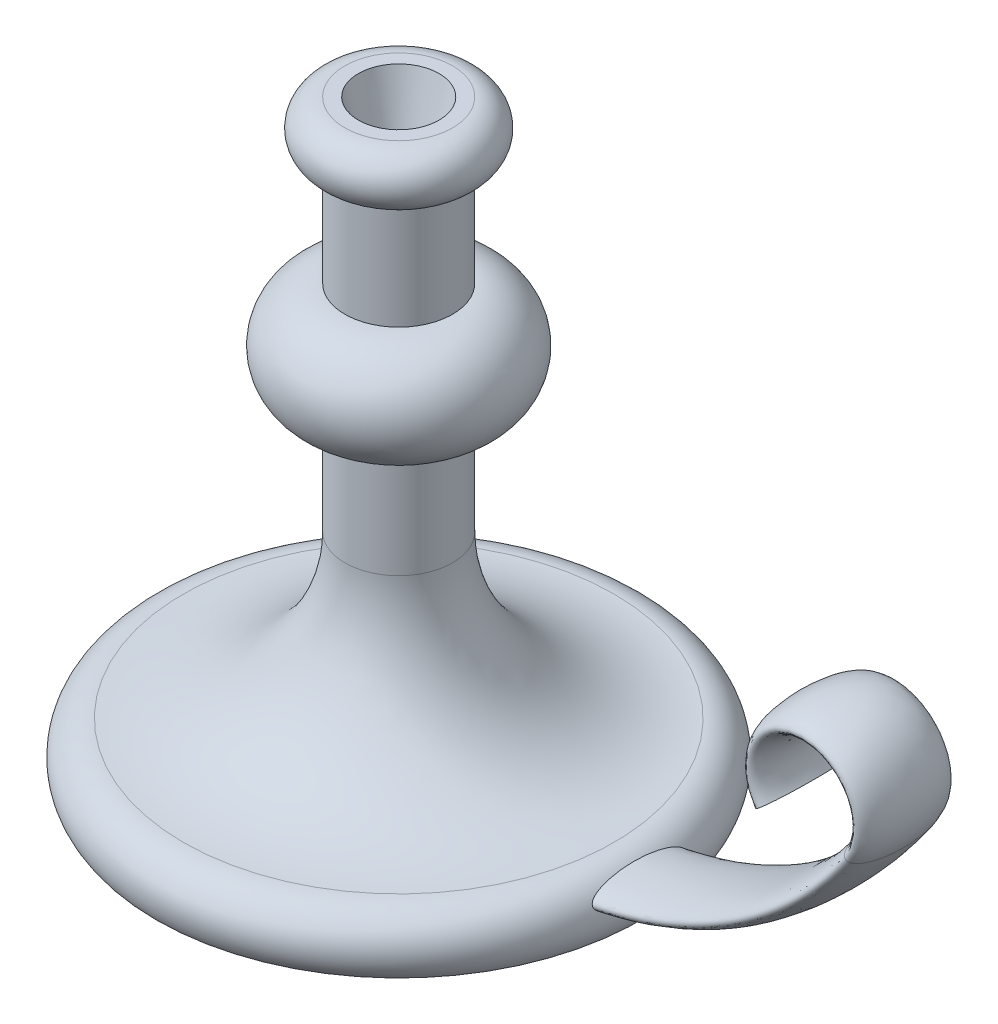
ISO-10303-21;
HEADER;
FILE_DESCRIPTION(('STEP AP214'),'2;1');
FILE_NAME('part.step','',(''),(''),'','','');
FILE_SCHEMA(('AUTOMOTIVE_DESIGN { 1 0 10303 214 1 1 1 1 }'));
ENDSEC;
DATA;
#1=APPLICATION_CONTEXT('core data for automotive mechanical design processes');
#2=APPLICATION_PROTOCOL_DEFINITION('international standard','automotive_design',2000,#1);
#3=PRODUCT_CONTEXT('',#1,'mechanical');
#4=PRODUCT('Part','Part','',(#3));
#5=PRODUCT_RELATED_PRODUCT_CATEGORY('part','',(#4));
#6=PRODUCT_DEFINITION_FORMATION('','',#4);
#7=PRODUCT_DEFINITION_CONTEXT('part definition',#1,'design');
#8=PRODUCT_DEFINITION('design','',#6,#7);
#9=PRODUCT_DEFINITION_SHAPE('','',#8);
#10=(LENGTH_UNIT() NAMED_UNIT(*) SI_UNIT(.MILLI.,.METRE.));
#11=(NAMED_UNIT(*) PLANE_ANGLE_UNIT() SI_UNIT($,.RADIAN.));
#12=(NAMED_UNIT(*) SI_UNIT($,.STERADIAN.) SOLID_ANGLE_UNIT());
#13=UNCERTAINTY_MEASURE_WITH_UNIT(LENGTH_MEASURE(1.E-05),#10,'distance_accuracy_value','');
#14=(GEOMETRIC_REPRESENTATION_CONTEXT(3) GLOBAL_UNCERTAINTY_ASSIGNED_CONTEXT((#13)) GLOBAL_UNIT_ASSIGNED_CONTEXT((#10,
#11,#12)) REPRESENTATION_CONTEXT('',''));
#15=CARTESIAN_POINT('',(0.,0.,0.));
#16=DIRECTION('',(0.,0.,1.));
#17=DIRECTION('',(1.,0.,0.));
#18=AXIS2_PLACEMENT_3D('',#15,#16,#17);
#19=CARTESIAN_POINT('',(0.,0.,0.));
#20=DIRECTION('',(0.,-1.,0.));
#21=DIRECTION('',(0.,0.,-1.));
#22=AXIS2_PLACEMENT_3D('',#19,#20,#21);
#23=PLANE('',#22);
#24=CARTESIAN_POINT('',(0.,0.,0.));
#25=DIRECTION('',(0.,-1.,0.));
#26=DIRECTION('',(0.,0.,-1.));
#27=AXIS2_PLACEMENT_3D('',#24,#25,#26);
#28=CIRCLE('',#27,90.);
#29=CARTESIAN_POINT('',(0.,0.,-90.));
#30=VERTEX_POINT('',#29);
#31=EDGE_CURVE('E76',#30,#30,#28,.T.);
#32=ORIENTED_EDGE('',*,*,#31,.T.);
#33=EDGE_LOOP('',(#32));
#34=FACE_BOUND('',#33,.T.);
#35=ADVANCED_FACE('F36',(#34),#23,.T.);
#36=CARTESIAN_POINT('',(0.,220.,0.));
#37=DIRECTION('',(0.,1.,0.));
#38=DIRECTION('',(0.,0.,1.));
#39=AXIS2_PLACEMENT_3D('',#36,#37,#38);
#40=PLANE('',#39);
#41=CARTESIAN_POINT('',(0.,220.,0.));
#42=DIRECTION('',(0.,1.,0.));
#43=DIRECTION('',(0.,0.,1.));
#44=AXIS2_PLACEMENT_3D('',#41,#42,#43);
#45=CIRCLE('',#44,15.);
#46=CARTESIAN_POINT('',(0.,220.,15.));
#47=VERTEX_POINT('',#46);
#48=EDGE_CURVE('E92',#47,#47,#45,.T.);
#49=ORIENTED_EDGE('',*,*,#48,.F.);
#50=EDGE_LOOP('',(#49));
#51=FACE_BOUND('',#50,.T.);
#52=CARTESIAN_POINT('',(0.,220.,0.));
#53=DIRECTION('',(0.,-1.,0.));
#54=DIRECTION('',(0.,0.,-1.));
#55=AXIS2_PLACEMENT_3D('',#52,#53,#54);
#56=CIRCLE('',#55,20.);
#57=CARTESIAN_POINT('',(0.,220.,-20.));
#58=VERTEX_POINT('',#57);
#59=EDGE_CURVE('E48',#58,#58,#56,.T.);
#60=ORIENTED_EDGE('',*,*,#59,.F.);
#61=EDGE_LOOP('',(#60));
#62=FACE_BOUND('',#61,.T.);
#63=ADVANCED_FACE('F99',(#51,#62),#40,.T.);
#64=CARTESIAN_POINT('',(0.,210.,0.));
#65=DIRECTION('',(0.,-1.,0.));
#66=DIRECTION('',(0.,0.,-1.));
#67=AXIS2_PLACEMENT_3D('',#64,#65,#66);
#68=TOROIDAL_SURFACE('',#67,20.,10.);
#69=ORIENTED_EDGE('',*,*,#59,.T.);
#70=EDGE_LOOP('',(#69));
#71=FACE_BOUND('',#70,.T.);
#72=CARTESIAN_POINT('',(0.,200.,0.));
#73=DIRECTION('',(0.,-1.,0.));
#74=DIRECTION('',(0.,0.,-1.));
#75=AXIS2_PLACEMENT_3D('',#72,#73,#74);
#76=CIRCLE('',#75,20.);
#77=CARTESIAN_POINT('',(0.,200.,-20.));
#78=VERTEX_POINT('',#77);
#79=EDGE_CURVE('E53',#78,#78,#76,.T.);
#80=ORIENTED_EDGE('',*,*,#79,.F.);
#81=EDGE_LOOP('',(#80));
#82=FACE_BOUND('',#81,.T.);
#83=ADVANCED_FACE('F102',(#71,#82),#68,.T.);
#84=CARTESIAN_POINT('',(0.,0.,0.));
#85=DIRECTION('',(0.,-1.,0.));
#86=DIRECTION('',(0.,0.,-1.));
#87=AXIS2_PLACEMENT_3D('',#84,#85,#86);
#88=CYLINDRICAL_SURFACE('',#87,20.);
#89=ORIENTED_EDGE('',*,*,#79,.T.);
#90=EDGE_LOOP('',(#89));
#91=FACE_BOUND('',#90,.T.);
#92=CARTESIAN_POINT('',(0.,160.,0.));
#93=DIRECTION('',(0.,-1.,0.));
#94=DIRECTION('',(0.,0.,-1.));
#95=AXIS2_PLACEMENT_3D('',#92,#93,#94);
#96=CIRCLE('',#95,20.);
#97=CARTESIAN_POINT('',(0.,160.,-20.));
#98=VERTEX_POINT('',#97);
#99=EDGE_CURVE('E58',#98,#98,#96,.T.);
#100=ORIENTED_EDGE('',*,*,#99,.F.);
#101=EDGE_LOOP('',(#100));
#102=FACE_BOUND('',#101,.T.);
#103=ADVANCED_FACE('F107',(#91,#102),#88,.T.);
#104=CARTESIAN_POINT('',(0.,140.,0.));
#105=DIRECTION('',(0.,-1.,0.));
#106=DIRECTION('',(0.,0.,-1.));
#107=AXIS2_PLACEMENT_3D('',#104,#105,#106);
#108=TOROIDAL_SURFACE('',#107,20.,20.);
#109=ORIENTED_EDGE('',*,*,#99,.T.);
#110=EDGE_LOOP('',(#109));
#111=FACE_BOUND('',#110,.T.);
#112=CARTESIAN_POINT('',(0.,120.,0.));
#113=DIRECTION('',(0.,-1.,0.));
#114=DIRECTION('',(0.,0.,-1.));
#115=AXIS2_PLACEMENT_3D('',#112,#113,#114);
#116=CIRCLE('',#115,20.);
#117=CARTESIAN_POINT('',(0.,120.,-20.));
#118=VERTEX_POINT('',#117);
#119=EDGE_CURVE('E64',#118,#118,#116,.T.);
#120=ORIENTED_EDGE('',*,*,#119,.F.);
#121=EDGE_LOOP('',(#120));
#122=FACE_BOUND('',#121,.T.);
#123=ADVANCED_FACE('F113',(#111,#122),#108,.T.);
#124=CARTESIAN_POINT('',(0.,0.,0.));
#125=DIRECTION('',(0.,-1.,0.));
#126=DIRECTION('',(0.,0.,-1.));
#127=AXIS2_PLACEMENT_3D('',#124,#125,#126);
#128=CYLINDRICAL_SURFACE('',#127,20.);
#129=ORIENTED_EDGE('',*,*,#119,.T.);
#130=EDGE_LOOP('',(#129));
#131=FACE_BOUND('',#130,.T.);
#132=CARTESIAN_POINT('',(0.,79.9999999999999,0.));
#133=DIRECTION('',(0.,-1.,0.));
#134=DIRECTION('',(0.,0.,-1.));
#135=AXIS2_PLACEMENT_3D('',#132,#133,#134);
#136=CIRCLE('',#135,20.);
#137=CARTESIAN_POINT('',(0.,79.9999999999999,-20.));
#138=VERTEX_POINT('',#137);
#139=EDGE_CURVE('E68',#138,#138,#136,.T.);
#140=ORIENTED_EDGE('',*,*,#139,.F.);
#141=EDGE_LOOP('',(#140));
#142=FACE_BOUND('',#141,.T.);
#143=ADVANCED_FACE('F117',(#131,#142),#128,.T.);
#144=CARTESIAN_POINT('',(0.,80.,0.));
#145=DIRECTION('',(0.,-1.,0.));
#146=DIRECTION('',(0.,0.,-1.));
#147=AXIS2_PLACEMENT_3D('',#144,#145,#146);
#148=TOROIDAL_SURFACE('',#147,80.,60.);
#149=ORIENTED_EDGE('',*,*,#139,.T.);
#150=EDGE_LOOP('',(#149));
#151=FACE_BOUND('',#150,.T.);
#152=CARTESIAN_POINT('',(0.,19.9999999999999,0.));
#153=DIRECTION('',(0.,-1.,0.));
#154=DIRECTION('',(0.,0.,-1.));
#155=AXIS2_PLACEMENT_3D('',#152,#153,#154);
#156=CIRCLE('',#155,79.9999999999999);
#157=CARTESIAN_POINT('',(0.,19.9999999999999,-79.9999999999999));
#158=VERTEX_POINT('',#157);
#159=EDGE_CURVE('E72',#158,#158,#156,.T.);
#160=ORIENTED_EDGE('',*,*,#159,.F.);
#161=EDGE_LOOP('',(#160));
#162=FACE_BOUND('',#161,.T.);
#163=ADVANCED_FACE('F121',(#151,#162),#148,.F.);
#164=CARTESIAN_POINT('',(0.,7.49999999999994,0.));
#165=DIRECTION('',(0.,-1.,0.));
#166=DIRECTION('',(0.,0.,-1.));
#167=AXIS2_PLACEMENT_3D('',#164,#165,#166);
#168=TOROIDAL_SURFACE('',#167,79.9999999999999,12.5);
#169=CARTESIAN_POINT('',(89.5597422043341,12.9414346567555,-17.5));
#170=CARTESIAN_POINT('',(89.5390618403561,12.9834100865229,-17.4999996776707));
#171=CARTESIAN_POINT('',(89.5184817634659,13.0254349004937,-17.4978446678338));
#172=CARTESIAN_POINT('',(89.4776811982743,13.1092324497794,-17.4892861575811));
#173=CARTESIAN_POINT('',(89.457460843071,13.151005088161,-17.4828811168849));
#174=CARTESIAN_POINT('',(89.3975402811209,13.2754779151414,-17.4575154450276));
#175=CARTESIAN_POINT('',(89.3585808220612,13.357332519418,-17.4324042670614));
#176=CARTESIAN_POINT('',(89.2734407804367,13.5379179993389,-17.3597430943198));
#177=CARTESIAN_POINT('',(89.2281116968573,13.6353152430682,-17.3079906529225));
#178=CARTESIAN_POINT('',(89.1421567137609,13.8217570109409,-17.1881654215547));
#179=CARTESIAN_POINT('',(89.1015409681599,13.9107834263932,-17.1200583326704));
#180=CARTESIAN_POINT('',(89.0298799325303,14.0690063055582,-16.9825317839868));
#181=CARTESIAN_POINT('',(88.998285603108,14.1392491335226,-16.9145677994464));
#182=CARTESIAN_POINT('',(88.9378435588021,14.2742914925202,-16.7722502997375));
#183=CARTESIAN_POINT('',(88.9089980734781,14.3390866000317,-16.6978916893925));
#184=CARTESIAN_POINT('',(88.8536099995593,14.4639626152392,-16.544217780153));
#185=CARTESIAN_POINT('',(88.8270733532936,14.5240313225779,-16.4648905452803));
#186=CARTESIAN_POINT('',(88.7760376587063,14.6398576639347,-16.302586394246));
#187=CARTESIAN_POINT('',(88.7515379613227,14.6956166708123,-16.219610653644));
#188=CARTESIAN_POINT('',(88.7047328205488,14.8023169553036,-16.052427362784));
#189=CARTESIAN_POINT('',(88.6823939519365,14.8533308765833,-15.9682752160745));
#190=CARTESIAN_POINT('',(88.6391553657589,14.9521540950118,-15.7977416210759));
#191=CARTESIAN_POINT('',(88.6182558899721,14.9999628537458,-15.711359801597));
#192=CARTESIAN_POINT('',(88.5573681790008,15.1392585624723,-15.4492483073625));
#193=CARTESIAN_POINT('',(88.5192579811327,15.2264609786255,-15.2707999543232));
#194=CARTESIAN_POINT('',(88.4468979005835,15.3916731276291,-14.9088289385943));
#195=CARTESIAN_POINT('',(88.4126513155025,15.4696750103546,-14.725302105289));
#196=CARTESIAN_POINT('',(88.3471391595039,15.6182965032923,-14.3538259785736));
#197=CARTESIAN_POINT('',(88.3158872528145,15.6888824046965,-14.1658608782526));
#198=CARTESIAN_POINT('',(88.2560127035515,15.8233792512431,-13.7874003918539));
#199=CARTESIAN_POINT('',(88.2273872233001,15.8872974109117,-13.5969079973402));
#200=CARTESIAN_POINT('',(88.1723348827448,16.0094159388249,-13.2138496737789));
#201=CARTESIAN_POINT('',(88.1459074726895,16.06761773743,-13.021284276893));
#202=CARTESIAN_POINT('',(88.0884248304701,16.1932687928886,-12.5849658119246));
#203=CARTESIAN_POINT('',(88.0579162002183,16.2592725226906,-12.3407253521733));
#204=CARTESIAN_POINT('',(87.9994625659012,16.3844358500305,-11.8501803460781));
#205=CARTESIAN_POINT('',(87.9715178234087,16.4435947494061,-11.6038755919221));
#206=CARTESIAN_POINT('',(87.9178897421857,16.5558889779776,-11.1095299870478));
#207=CARTESIAN_POINT('',(87.8922075114268,16.6090213595568,-10.8614883492399));
#208=CARTESIAN_POINT('',(87.8429155378602,16.7098546386226,-10.3640943607017));
#209=CARTESIAN_POINT('',(87.8193058942811,16.7575552760879,-10.114741947821));
#210=CARTESIAN_POINT('',(87.7514718906046,16.8930622945828,-9.36631396644892));
#211=CARTESIAN_POINT('',(87.7101114199139,16.97354616682,-8.86564202060306));
#212=CARTESIAN_POINT('',(87.6344118706352,17.1178657179368,-7.8615355184022));
#213=CARTESIAN_POINT('',(87.6000713341079,17.1817048544489,-7.35810155802556));
#214=CARTESIAN_POINT('',(87.5383679228553,17.2943697092708,-6.35225136111865));
#215=CARTESIAN_POINT('',(87.5109639050817,17.3432843238913,-5.84984753787548));
#216=CARTESIAN_POINT('',(87.462839163061,17.4279603163538,-4.84354228831003));
#217=CARTESIAN_POINT('',(87.4421195253372,17.4637195559667,-4.33964063194082));
#218=CARTESIAN_POINT('',(87.4074386787954,17.5229738360404,-3.33084363886006));
#219=CARTESIAN_POINT('',(87.3934780874881,17.5464677559495,-2.82594821558674));
#220=CARTESIAN_POINT('',(87.3724154174234,17.5817273168609,-1.81615213380797));
#221=CARTESIAN_POINT('',(87.3653059747338,17.5935055508652,-1.31125206554514));
#222=CARTESIAN_POINT('',(87.3579750479623,17.6056484066489,-0.30131830913285));
#223=CARTESIAN_POINT('',(87.3577528582349,17.6060141977103,0.203715360026147));
#224=CARTESIAN_POINT('',(87.3641963426437,17.5953454261038,1.21356726554174));
#225=CARTESIAN_POINT('',(87.3708612610895,17.5843121142068,1.71838551945514));
#226=CARTESIAN_POINT('',(87.3886163883337,17.554616306541,2.60695068649857));
#227=CARTESIAN_POINT('',(87.3982690399212,17.5384060734754,2.99081046478844));
#228=CARTESIAN_POINT('',(87.4214966880659,17.4990063104014,3.75807002785717));
#229=CARTESIAN_POINT('',(87.4350718235979,17.4758165331044,4.14146979585433));
#230=CARTESIAN_POINT('',(87.4661109016121,17.4221255760208,4.90767543763214));
#231=CARTESIAN_POINT('',(87.4835755913648,17.3916229911934,5.29048118303764));
#232=CARTESIAN_POINT('',(87.5224765269599,17.3226675403927,6.05728766608042));
#233=CARTESIAN_POINT('',(87.5439339089183,17.2841722314846,6.44128353835447));
#234=CARTESIAN_POINT('',(87.5907685418076,17.1987228636429,7.20803081067562));
#235=CARTESIAN_POINT('',(87.6161451191905,17.1517702579396,7.59078241304236));
#236=CARTESIAN_POINT('',(87.6708875244927,17.0486132676472,8.35453102594121));
#237=CARTESIAN_POINT('',(87.7002509792863,16.9924143825779,8.73552894189142));
#238=CARTESIAN_POINT('',(87.7555693385741,16.8844873931684,9.40362807317352));
#239=CARTESIAN_POINT('',(87.780631862629,16.8349635590468,9.69115955865568));
#240=CARTESIAN_POINT('',(87.8333287645207,16.7293167465828,10.2648242071223));
#241=CARTESIAN_POINT('',(87.8609635304671,16.6731927720484,10.5509571522123));
#242=CARTESIAN_POINT('',(87.9190678138248,16.5534902310351,11.1217112831613));
#243=CARTESIAN_POINT('',(87.9495404231883,16.4899035134825,11.4063304543325));
#244=CARTESIAN_POINT('',(88.0137266324375,16.3541216812726,11.9738772339477));
#245=CARTESIAN_POINT('',(88.0474477220506,16.2819065762201,12.2567992545899));
#246=CARTESIAN_POINT('',(88.1183718381952,16.1280994435203,12.8175821097589));
#247=CARTESIAN_POINT('',(88.1555499028382,16.046573796357,13.0954641920683));
#248=CARTESIAN_POINT('',(88.2343580118384,15.8719007074313,13.6468218234688));
#249=CARTESIAN_POINT('',(88.2759857295858,15.7787593350284,13.9202995902183));
#250=CARTESIAN_POINT('',(88.3426568223938,15.6283840406489,14.3254052817093));
#251=CARTESIAN_POINT('',(88.3655500017784,15.5765627213431,14.4594023169281));
#252=CARTESIAN_POINT('',(88.4129882653632,15.4688611687534,14.7254525655376));
#253=CARTESIAN_POINT('',(88.437533168995,15.4129813790935,14.8575059894888));
#254=CARTESIAN_POINT('',(88.4884967907571,15.296726972035,15.1188747284344));
#255=CARTESIAN_POINT('',(88.5149109123158,15.2363633637365,15.248195809858));
#256=CARTESIAN_POINT('',(88.5700241751771,15.1103179001211,15.5037035642082));
#257=CARTESIAN_POINT('',(88.5987227483177,15.0446373670988,15.6298910063174));
#258=CARTESIAN_POINT('',(88.6570151826477,14.9113179601608,15.870419970706));
#259=CARTESIAN_POINT('',(88.686441736786,14.8440563407288,15.9850095995261));
#260=CARTESIAN_POINT('',(88.7482816567767,14.7030103830826,16.2094581395953));
#261=CARTESIAN_POINT('',(88.780697475614,14.629220689998,16.3193130551169));
#262=CARTESIAN_POINT('',(88.8489097184971,14.4745639616531,16.5315146626624));
#263=CARTESIAN_POINT('',(88.8846785573507,14.393755019161,16.6339121024917));
#264=CARTESIAN_POINT('',(88.9606113704153,14.2232561160766,16.8291907541923));
#265=CARTESIAN_POINT('',(89.0007675950254,14.1335818404865,16.9220882016583));
#266=CARTESIAN_POINT('',(89.0601235459872,14.0021924630804,17.0411637727685));
#267=CARTESIAN_POINT('',(89.0770574086404,13.9648250339927,17.073294917827));
#268=CARTESIAN_POINT('',(89.1117704043088,13.8885105828122,17.1351129203988));
#269=CARTESIAN_POINT('',(89.1295494801998,13.8495636674961,17.1647999427302));
#270=CARTESIAN_POINT('',(89.1842722230346,13.7301865324197,17.2496672583031));
#271=CARTESIAN_POINT('',(89.2225929343974,13.6472387371286,17.3006362954167));
#272=CARTESIAN_POINT('',(89.2830198855203,13.5177923286576,17.3659392171785));
#273=CARTESIAN_POINT('',(89.3038035106325,13.4734899832391,17.385944655127));
#274=CARTESIAN_POINT('',(89.346235727213,13.3835498526412,17.421521231844));
#275=CARTESIAN_POINT('',(89.3678838017235,13.3379128698457,17.4370949768747));
#276=CARTESIAN_POINT('',(89.4119048024239,13.2456714845448,17.4633118273199));
#277=CARTESIAN_POINT('',(89.4342765183815,13.1990687398023,17.4739627514632));
#278=CARTESIAN_POINT('',(89.4796070415906,13.1052444737537,17.4900003628641));
#279=CARTESIAN_POINT('',(89.5025657624808,13.0580230439622,17.495387819971));
#280=CARTESIAN_POINT('',(89.5464271716018,12.9684112208445,17.5004320668286));
#281=CARTESIAN_POINT('',(89.5672934245651,12.9260327119426,17.5006298436875));
#282=CARTESIAN_POINT('',(89.6091580078856,12.8415284156483,17.496667300483));
#283=CARTESIAN_POINT('',(89.6301563797467,12.7994027167221,17.4925055351934));
#284=CARTESIAN_POINT('',(89.672115635143,12.7157496198108,17.479965082583));
#285=CARTESIAN_POINT('',(89.6930765014329,12.6742224548788,17.4715847960013));
#286=CARTESIAN_POINT('',(89.7348115258833,12.5920532516238,17.450862522026));
#287=CARTESIAN_POINT('',(89.7555855765779,12.5514117057388,17.4385183877269));
#288=CARTESIAN_POINT('',(89.8013847331775,12.4623676182576,17.4070626989759));
#289=CARTESIAN_POINT('',(89.8263321178973,12.4142402057078,17.3870577635768));
#290=CARTESIAN_POINT('',(89.8756026524762,12.3198942829529,17.3423007335127));
#291=CARTESIAN_POINT('',(89.8999253272691,12.2736772101063,17.317545140678));
#292=CARTESIAN_POINT('',(89.9718636752114,12.1379719567038,17.2371059859824));
#293=CARTESIAN_POINT('',(90.0184026508767,12.051520920799,17.1752845379973));
#294=CARTESIAN_POINT('',(90.1015176697337,11.8991704299986,17.0502729237444));
#295=CARTESIAN_POINT('',(90.1385373685484,11.8321383297489,16.9886971231213));
#296=CARTESIAN_POINT('',(90.2104869329279,11.7032426034951,16.8591573255862));
#297=CARTESIAN_POINT('',(90.2454151408799,11.6413830620089,16.7911883686367));
#298=CARTESIAN_POINT('',(90.3133841124365,11.5222099067342,16.6502911436157));
#299=CARTESIAN_POINT('',(90.3464212107124,11.4649050425,16.577353807455));
#300=CARTESIAN_POINT('',(90.4107258034174,11.3544143267812,16.4277349965839));
#301=CARTESIAN_POINT('',(90.4419937497579,11.3012274221162,16.3510544874357));
#302=CARTESIAN_POINT('',(90.5066142435687,11.1922810586096,16.1853189525369));
#303=CARTESIAN_POINT('',(90.5397652495638,11.1369814833086,16.0958847835331));
#304=CARTESIAN_POINT('',(90.6043042941241,11.0303194621557,15.9140859303205));
#305=CARTESIAN_POINT('',(90.6356921559875,10.9789574107339,15.8217209538335));
#306=CARTESIAN_POINT('',(90.696838387797,10.879769884165,15.6347974994412));
#307=CARTESIAN_POINT('',(90.7265992701636,10.8319389137697,15.5402427441419));
#308=CARTESIAN_POINT('',(90.7846969346251,10.739329513768,15.3492353522604));
#309=CARTESIAN_POINT('',(90.8130337948204,10.6945509167066,15.2527828201663));
#310=CARTESIAN_POINT('',(90.877121220524,10.5940589597549,15.0277319837682));
#311=CARTESIAN_POINT('',(90.9124022819657,10.5393328792865,14.898559344014));
#312=CARTESIAN_POINT('',(90.98097411038,10.4339610325183,14.6380328432607));
#313=CARTESIAN_POINT('',(91.0142645951402,10.3833158444317,14.5066786763346));
#314=CARTESIAN_POINT('',(91.1115171918213,10.2366440116076,14.1096810918779));
#315=CARTESIAN_POINT('',(91.1727828792966,10.1460018602113,13.8413800425917));
#316=CARTESIAN_POINT('',(91.2892862812459,9.97615455726905,13.2997906638456));
#317=CARTESIAN_POINT('',(91.3445203789087,9.8969562588703,13.0264994554533));
#318=CARTESIAN_POINT('',(91.449980571998,9.74769654866259,12.4748594155945));
#319=CARTESIAN_POINT('',(91.5001780442572,9.67768673078011,12.1964912536695));
#320=CARTESIAN_POINT('',(91.5957501918067,9.5459253441638,11.6372393425741));
#321=CARTESIAN_POINT('',(91.6411285723793,9.48416742117623,11.3563577087903));
#322=CARTESIAN_POINT('',(91.7275132616964,9.36779787162542,10.7925089006672));
#323=CARTESIAN_POINT('',(91.768520272942,9.31318509647918,10.5095420692678));
#324=CARTESIAN_POINT('',(91.8503345045437,9.205205087118,9.91387150213558));
#325=CARTESIAN_POINT('',(91.8907217744488,9.15249390095806,9.60099168323537));
#326=CARTESIAN_POINT('',(91.9669218199108,9.05389158705527,8.9735968818187));
#327=CARTESIAN_POINT('',(92.002734366163,9.00800080116133,8.65908181815844));
#328=CARTESIAN_POINT('',(92.07003298894,8.92240020575302,8.02865568808677));
#329=CARTESIAN_POINT('',(92.1015177516249,8.8826922727619,7.71274422766391));
#330=CARTESIAN_POINT('',(92.1603325838502,8.80898713679301,7.07986626810507));
#331=CARTESIAN_POINT('',(92.1876625005419,8.77499014390495,6.76289973059294));
#332=CARTESIAN_POINT('',(92.263503001365,8.68114273902093,5.81249868362128));
#333=CARTESIAN_POINT('',(92.3060517448553,8.62919999492187,5.17778747193751));
#334=CARTESIAN_POINT('',(92.3760091017524,8.54431318450686,3.90627938186728));
#335=CARTESIAN_POINT('',(92.4034169750228,8.51137004695184,3.26948240305189));
#336=CARTESIAN_POINT('',(92.4435085691827,8.46331702284116,1.99545741778343));
#337=CARTESIAN_POINT('',(92.4562084043365,8.44818761908844,1.35823064985317));
#338=CARTESIAN_POINT('',(92.4671302630246,8.43517103988551,0.0834423270804831));
#339=CARTESIAN_POINT('',(92.4653514271758,8.43728488791031,-0.554119245388395));
#340=CARTESIAN_POINT('',(92.4472853754492,8.45883344750921,-1.82886328297022));
#341=CARTESIAN_POINT('',(92.4309954438923,8.47827140120328,-2.46604565478136));
#342=CARTESIAN_POINT('',(92.3836590626409,8.53514174464794,-3.73902583867047));
#343=CARTESIAN_POINT('',(92.3526140808132,8.57257234445221,-4.37482378215548));
#344=CARTESIAN_POINT('',(92.2921790866403,8.64621329194997,-5.36625544461022));
#345=CARTESIAN_POINT('',(92.2680118235607,8.67578736963481,-5.72271555901907));
#346=CARTESIAN_POINT('',(92.2147013952354,8.74146404735391,-6.43465819603334));
#347=CARTESIAN_POINT('',(92.1855583836332,8.77756644580539,-6.79014074848012));
#348=CARTESIAN_POINT('',(92.1221127048892,8.85679311513352,-7.49983836059509));
#349=CARTESIAN_POINT('',(92.0878103957548,8.89991689880824,-7.85405350646489));
#350=CARTESIAN_POINT('',(92.0137981226249,8.99384143269651,-8.56089767223939));
#351=CARTESIAN_POINT('',(91.9740883343957,9.04464193338982,-8.91352674331361));
#352=CARTESIAN_POINT('',(91.9015818240063,9.13842562293718,-9.51226790233131));
#353=CARTESIAN_POINT('',(91.870237065407,9.17924629619436,-9.75889575934216));
#354=CARTESIAN_POINT('',(91.8045624920056,9.26550036635913,-10.2509419620304));
#355=CARTESIAN_POINT('',(91.7702327567069,9.31093364041769,-10.4963603397378));
#356=CARTESIAN_POINT('',(91.6984266463271,9.40685898724882,-10.9855805665737));
#357=CARTESIAN_POINT('',(91.6609523533815,9.45734771681966,-11.2293833718168));
#358=CARTESIAN_POINT('',(91.5826038967891,9.56401317099027,-11.7151775621049));
#359=CARTESIAN_POINT('',(91.5417298772535,9.62018965451316,-11.9571690234576));
#360=CARTESIAN_POINT('',(91.4386423376746,9.76351210996385,-12.5384162018485));
#361=CARTESIAN_POINT('',(91.3745858903287,9.85386844470747,-12.8765786557773));
#362=CARTESIAN_POINT('',(91.2720163238266,10.0014015523807,-13.3793136041313));
#363=CARTESIAN_POINT('',(91.2367090969992,10.0526332971694,-13.5462966135008));
#364=CARTESIAN_POINT('',(91.1637294936456,10.1596261841619,-13.8782853379556));
#365=CARTESIAN_POINT('',(91.126057223172,10.2153871233019,-14.0432911413075));
#366=CARTESIAN_POINT('',(91.0448513753996,10.3369382727869,-14.3844416693129));
#367=CARTESIAN_POINT('',(91.0010908407914,10.4031767890598,-14.5603739146116));
#368=CARTESIAN_POINT('',(90.9100440331645,10.5428509324198,-14.9085311659832));
#369=CARTESIAN_POINT('',(90.8627565865344,10.6162889577864,-15.0807549132315));
#370=CARTESIAN_POINT('',(90.7642492199853,10.7715651970482,-15.4195496037304));
#371=CARTESIAN_POINT('',(90.7130423069865,10.8533759065569,-15.5861368065586));
#372=CARTESIAN_POINT('',(90.6058220172112,11.027534891643,-15.912038612695));
#373=CARTESIAN_POINT('',(90.5498128203451,11.1198740259081,-16.0713593593325));
#374=CARTESIAN_POINT('',(90.4444082893049,11.2969255920342,-16.3465910082041));
#375=CARTESIAN_POINT('',(90.3961277047703,11.3791055101426,-16.464544833619));
#376=CARTESIAN_POINT('',(90.2950977924846,11.5538633486868,-16.6911566146552));
#377=CARTESIAN_POINT('',(90.2423390562531,11.6464633011954,-16.7997939840168));
#378=CARTESIAN_POINT('',(90.1590440243456,11.7953014200274,-16.9524870890687));
#379=CARTESIAN_POINT('',(90.1303607600846,11.8469859215398,-17.0019977189782));
#380=CARTESIAN_POINT('',(90.0716181087374,11.9538274561511,-17.09631026111));
#381=CARTESIAN_POINT('',(90.0415584049393,12.0089852895525,-17.141111081734));
#382=CARTESIAN_POINT('',(89.9801756575595,12.1227246632091,-17.2246441347398));
#383=CARTESIAN_POINT('',(89.948857753765,12.181292641625,-17.2633984155373));
#384=CARTESIAN_POINT('',(89.8849549671327,12.3020144005062,-17.3335784406432));
#385=CARTESIAN_POINT('',(89.8523712452272,12.3641649194656,-17.3650107233705));
#386=CARTESIAN_POINT('',(89.7981176909033,12.4687258013536,-17.4092508881815));
#387=CARTESIAN_POINT('',(89.7767436177654,12.5101841078546,-17.4246893204628));
#388=CARTESIAN_POINT('',(89.7336969050674,12.5942336377178,-17.4515182330193));
#389=CARTESIAN_POINT('',(89.7120243813911,12.636824427018,-17.4629102408533));
#390=CARTESIAN_POINT('',(89.6685521390582,12.7228207531292,-17.4812886417918));
#391=CARTESIAN_POINT('',(89.6467526103345,12.766225219827,-17.488280453409));
#392=CARTESIAN_POINT('',(89.6031794397246,12.8535466229688,-17.4976362320133));
#393=CARTESIAN_POINT('',(89.5814057970822,12.8974635440192,-17.5000003376542));
#394=CARTESIAN_POINT('',(89.5597422043341,12.9414346567555,-17.5));
#395=B_SPLINE_CURVE_WITH_KNOTS('',3,(#169,#170,#171,#172,#173,#174,#175,#176,#177,#178,#179,
#180,#181,#182,#183,#184,#185,#186,#187,#188,#189,#190,#191,#192,#193,#194,#195,#196,#197,#198,
#199,#200,#201,#202,#203,#204,#205,#206,#207,#208,#209,#210,#211,#212,#213,#214,#215,#216,#217,
#218,#219,#220,#221,#222,#223,#224,#225,#226,#227,#228,#229,#230,#231,#232,#233,#234,#235,#236,
#237,#238,#239,#240,#241,#242,#243,#244,#245,#246,#247,#248,#249,#250,#251,#252,#253,#254,#255,
#256,#257,#258,#259,#260,#261,#262,#263,#264,#265,#266,#267,#268,#269,#270,#271,#272,#273,#274,
#275,#276,#277,#278,#279,#280,#281,#282,#283,#284,#285,#286,#287,#288,#289,#290,#291,#292,#293,
#294,#295,#296,#297,#298,#299,#300,#301,#302,#303,#304,#305,#306,#307,#308,#309,#310,#311,#312,
#313,#314,#315,#316,#317,#318,#319,#320,#321,#322,#323,#324,#325,#326,#327,#328,#329,#330,#331,
#332,#333,#334,#335,#336,#337,#338,#339,#340,#341,#342,#343,#344,#345,#346,#347,#348,#349,#350,
#351,#352,#353,#354,#355,#356,#357,#358,#359,#360,#361,#362,#363,#364,#365,#366,#367,#368,#369,
#370,#371,#372,#373,#374,#375,#376,#377,#378,#379,#380,#381,#382,#383,#384,#385,#386,#387,#388,
#389,#390,#391,#392,#393,#394),.UNSPECIFIED.,.T.,.F.,(4,2,2,2,2,2,2,2,2,2,2,2,2,2,2,2,2,2,2,2,2,
2,2,2,2,2,2,2,2,2,2,2,2,2,2,2,2,2,2,2,2,2,2,2,2,2,2,2,2,2,2,2,2,2,2,2,2,2,2,2,2,2,2,2,2,2,2,2,2,
2,2,2,2,2,2,2,2,2,2,2,2,2,2,2,2,2,2,2,2,2,2,2,2,2,2,2,2,2,2,2,2,2,2,2,2,2,2,2,2,2,2,2,4),(0.,
0.140326879649327,0.280704643844324,0.561461806499966,0.91722571758583,1.27374235386087,
1.58146302398149,1.88943119593644,2.19816989275477,2.50680983170028,2.80944292372752,
3.11212672643259,3.71838915770196,4.3251651816825,4.93458970782547,5.5433478409354,
6.15195325906652,6.9163191102905,7.68076285707092,8.44557890144731,9.21043154271136,
10.7363530227228,12.2619572680852,13.7782885580524,15.2948661984784,16.8115823682403,
18.3266664767785,19.8415953542036,21.3563580231469,22.5092504482308,23.6621837256809,
24.8153386988898,25.9747813799631,27.1340250219355,28.2925816429425,29.1710242088839,
30.0495995331115,30.9291435591543,31.8107663507034,32.6864555684208,33.5616891298976,
33.9980703124478,34.4344038665403,34.8696994156047,35.304887039303,35.7129485465614,
36.1213479397353,36.5266413619585,36.931230132163,37.0874810726011,37.2437214677038,
37.5562829439449,37.7147148343191,37.8730533580127,38.0311395270883,38.1892025705742,
38.3307149014328,38.4722741597123,38.6138871242241,38.7555769191151,38.9286541005773,
39.1018592207181,39.448590135234,39.7429975955386,40.0376353818192,40.3328261359408,
40.6279411430423,40.9585479808936,41.2891878931731,41.6193018978017,41.9493977775691,
42.3832551508601,42.8171738887972,43.685946791877,44.5552378220704,45.4292182663366,
46.3025217875283,47.1756847521815,48.1351081860337,49.0945796914527,50.0543418354866,
51.0141392787939,52.9283366636017,54.8426276125091,56.7548192562819,58.6671243992171,
60.5797874956872,62.4922603557705,63.5676819321856,64.6430703071881,65.7183840946033,
66.7936629380629,67.5494303160607,68.3051775707195,69.060428305378,69.8156470419356,
70.8826765887354,71.4172057561801,71.9517109715331,72.5305894861729,73.1096614946435,
73.6868888443995,74.2636187787014,74.7180950553377,75.173551000909,75.4046853668803,
75.6358731855897,75.8661972266866,76.0963147970918,76.2435550398535,76.3907396389803,
76.5377426347989,76.6847412260987),.UNSPECIFIED.);
#396=CARTESIAN_POINT('',(89.5597422043341,12.9414346567555,-17.5));
#397=VERTEX_POINT('',#396);
#398=EDGE_CURVE('E10',#397,#397,#395,.T.);
#399=ORIENTED_EDGE('',*,*,#398,.F.);
#400=EDGE_LOOP('',(#399));
#401=FACE_BOUND('',#400,.T.);
#402=ORIENTED_EDGE('',*,*,#159,.T.);
#403=EDGE_LOOP('',(#402));
#404=FACE_BOUND('',#403,.T.);
#405=ORIENTED_EDGE('',*,*,#31,.F.);
#406=EDGE_LOOP('',(#405));
#407=FACE_BOUND('',#406,.T.);
#408=ADVANCED_FACE('F124',(#401,#404,#407),#168,.T.);
#409=CARTESIAN_POINT('',(150.634185358261,75.,0.));
#410=DIRECTION('',(0.566666666666667,-0.823947139620552,0.));
#411=DIRECTION('',(0.,0.,-1.));
#412=AXIS2_PLACEMENT_3D('',#409,#410,#411);
#413=PLANE('',#412);
#414=CARTESIAN_POINT('',(150.634185358261,75.,0.));
#415=DIRECTION('',(0.566666666666667,-0.823947139620552,0.));
#416=DIRECTION('',(0.,0.,-1.));
#417=AXIS2_PLACEMENT_3D('',#414,#415,#416);
#418=ELLIPSE('',#417,17.5,5.);
#419=CARTESIAN_POINT('',(150.634185358261,75.,-17.5));
#420=VERTEX_POINT('',#419);
#421=EDGE_CURVE('E80',#420,#420,#418,.T.);
#422=ORIENTED_EDGE('',*,*,#421,.T.);
#423=EDGE_LOOP('',(#422));
#424=FACE_BOUND('',#423,.T.);
#425=ADVANCED_FACE('F129',(#424),#413,.T.);
#426=CARTESIAN_POINT('',(60.,10.,-17.5));
#427=CARTESIAN_POINT('',(110.410191303973,10.,-17.5));
#428=CARTESIAN_POINT('',(155.026295870831,33.4646670673665,-17.5));
#429=CARTESIAN_POINT('',(183.592070943083,75.,-17.5));
#430=CARTESIAN_POINT('',(60.,20.,-17.5));
#431=CARTESIAN_POINT('',(107.049511883708,20.,-17.5));
#432=CARTESIAN_POINT('',(148.691209479443,41.9003559295421,-17.5));
#433=CARTESIAN_POINT('',(175.352599546877,80.6666666666666,-17.5));
#434=CARTESIAN_POINT('',(60.,20.,17.5));
#435=CARTESIAN_POINT('',(107.049511883708,20.,17.5));
#436=CARTESIAN_POINT('',(148.691209479443,41.9003559295421,17.5));
#437=CARTESIAN_POINT('',(175.352599546877,80.6666666666666,17.5));
#438=CARTESIAN_POINT('',(60.,10.,17.5));
#439=CARTESIAN_POINT('',(110.410191303973,10.,17.5));
#440=CARTESIAN_POINT('',(155.026295870831,33.4646670673665,17.5));
#441=CARTESIAN_POINT('',(183.592070943083,75.,17.5));
#442=CARTESIAN_POINT('',(60.,0.,17.5));
#443=CARTESIAN_POINT('',(113.770870724238,0.,17.5));
#444=CARTESIAN_POINT('',(161.36138226222,25.0289782051909,17.5));
#445=CARTESIAN_POINT('',(191.831542339288,69.3333333333333,17.5));
#446=CARTESIAN_POINT('',(60.,0.,-17.5));
#447=CARTESIAN_POINT('',(113.770870724238,0.,-17.5));
#448=CARTESIAN_POINT('',(161.36138226222,25.0289782051909,-17.5));
#449=CARTESIAN_POINT('',(191.831542339288,69.3333333333333,-17.5));
#450=CARTESIAN_POINT('',(60.,10.,-17.5));
#451=CARTESIAN_POINT('',(110.410191303973,10.,-17.5));
#452=CARTESIAN_POINT('',(155.026295870831,33.4646670673665,-17.5));
#453=CARTESIAN_POINT('',(183.592070943083,75.,-17.5));
#454=(BOUNDED_SURFACE() B_SPLINE_SURFACE(3,3,((#426,#427,#428,#429),(#430,#431,#432,#433),(#434,
#435,#436,#437),(#438,#439,#440,#441),(#442,#443,#444,#445),(#446,#447,#448,#449),(#450,#451,
#452,#453)),.UNSPECIFIED.,.T.,.F.,.F.) B_SPLINE_SURFACE_WITH_KNOTS((4,3,4),(4,4),(0.,0.5,1.),
(0.,1.),.UNSPECIFIED.) GEOMETRIC_REPRESENTATION_ITEM() RATIONAL_B_SPLINE_SURFACE(((1.,
0.923374135437856,0.923374135437856,1.),(0.333333333333333,0.307791378479285,0.307791378479285,
0.333333333333333),(0.333333333333333,0.307791378479285,0.307791378479285,0.333333333333333),
(1.,0.923374135437856,0.923374135437856,1.),(0.333333333333333,0.307791378479285,
0.307791378479285,0.333333333333333),(0.333333333333333,0.307791378479285,0.307791378479285,
0.333333333333333),(1.,0.923374135437856,0.923374135437856,1.))) REPRESENTATION_ITEM('') SURFACE());
#455=CARTESIAN_POINT('',(183.592070943083,75.,0.));
#456=DIRECTION('',(0.566666666666667,0.823947139620552,0.));
#457=DIRECTION('',(0.,0.,-1.));
#458=AXIS2_PLACEMENT_3D('',#455,#456,#457);
#459=ELLIPSE('',#458,17.5,5.);
#460=CARTESIAN_POINT('',(183.592070943083,75.,-17.5));
#461=VERTEX_POINT('',#460);
#462=EDGE_CURVE('E84',#461,#461,#459,.T.);
#463=ORIENTED_EDGE('',*,*,#398,.T.);
#464=EDGE_LOOP('',(#463));
#465=FACE_BOUND('',#464,.T.);
#466=ORIENTED_EDGE('',*,*,#462,.F.);
#467=EDGE_LOOP('',(#466));
#468=FACE_BOUND('',#467,.T.);
#469=ADVANCED_FACE('F134',(#465,#468),#454,.T.);
#470=CARTESIAN_POINT('',(183.592070943083,75.,-17.5));
#471=CARTESIAN_POINT('',(193.981461744242,90.10642735238,-17.5));
#472=CARTESIAN_POINT('',(185.447347211541,106.333333333333,-17.5));
#473=CARTESIAN_POINT('',(167.113128150672,106.333333333333,-17.5));
#474=CARTESIAN_POINT('',(148.778909089802,106.333333333333,-17.5));
#475=CARTESIAN_POINT('',(140.244794557101,90.1064273523801,-17.5));
#476=CARTESIAN_POINT('',(150.634185358261,75.,-17.5));
#477=CARTESIAN_POINT('',(175.352599546877,80.6666666666667,-17.5));
#478=CARTESIAN_POINT('',(180.547294947457,88.2198803428567,-17.5));
#479=CARTESIAN_POINT('',(176.280237681107,96.3333333333333,-17.5));
#480=CARTESIAN_POINT('',(167.113128150672,96.3333333333333,-17.5));
#481=CARTESIAN_POINT('',(157.946018620237,96.3333333333334,-17.5));
#482=CARTESIAN_POINT('',(153.678961353887,88.2198803428568,-17.5));
#483=CARTESIAN_POINT('',(158.873656754466,80.6666666666667,-17.5));
#484=CARTESIAN_POINT('',(175.352599546877,80.6666666666667,17.5));
#485=CARTESIAN_POINT('',(180.547294947457,88.2198803428567,17.5));
#486=CARTESIAN_POINT('',(176.280237681107,96.3333333333333,17.5));
#487=CARTESIAN_POINT('',(167.113128150672,96.3333333333333,17.5));
#488=CARTESIAN_POINT('',(157.946018620237,96.3333333333334,17.5));
#489=CARTESIAN_POINT('',(153.678961353887,88.2198803428568,17.5));
#490=CARTESIAN_POINT('',(158.873656754466,80.6666666666667,17.5));
#491=CARTESIAN_POINT('',(183.592070943083,75.,17.5));
#492=CARTESIAN_POINT('',(193.981461744242,90.10642735238,17.5));
#493=CARTESIAN_POINT('',(185.447347211541,106.333333333333,17.5));
#494=CARTESIAN_POINT('',(167.113128150672,106.333333333333,17.5));
#495=CARTESIAN_POINT('',(148.778909089802,106.333333333333,17.5));
#496=CARTESIAN_POINT('',(140.244794557101,90.1064273523801,17.5));
#497=CARTESIAN_POINT('',(150.634185358261,75.,17.5));
#498=CARTESIAN_POINT('',(191.831542339288,69.3333333333333,17.5));
#499=CARTESIAN_POINT('',(207.415628541027,91.9929743619034,17.5));
#500=CARTESIAN_POINT('',(194.614456741976,116.333333333333,17.5));
#501=CARTESIAN_POINT('',(167.113128150672,116.333333333333,17.5));
#502=CARTESIAN_POINT('',(139.611799559367,116.333333333333,17.5));
#503=CARTESIAN_POINT('',(126.810627760316,91.9929743619035,17.5));
#504=CARTESIAN_POINT('',(142.394713962055,69.3333333333334,17.5));
#505=CARTESIAN_POINT('',(191.831542339288,69.3333333333333,-17.5));
#506=CARTESIAN_POINT('',(207.415628541027,91.9929743619034,-17.5));
#507=CARTESIAN_POINT('',(194.614456741976,116.333333333333,-17.5));
#508=CARTESIAN_POINT('',(167.113128150672,116.333333333333,-17.5));
#509=CARTESIAN_POINT('',(139.611799559367,116.333333333333,-17.5));
#510=CARTESIAN_POINT('',(126.810627760316,91.9929743619035,-17.5));
#511=CARTESIAN_POINT('',(142.394713962055,69.3333333333334,-17.5));
#512=CARTESIAN_POINT('',(183.592070943083,75.,-17.5));
#513=CARTESIAN_POINT('',(193.981461744242,90.10642735238,-17.5));
#514=CARTESIAN_POINT('',(185.447347211541,106.333333333333,-17.5));
#515=CARTESIAN_POINT('',(167.113128150672,106.333333333333,-17.5));
#516=CARTESIAN_POINT('',(148.778909089802,106.333333333333,-17.5));
#517=CARTESIAN_POINT('',(140.244794557101,90.1064273523801,-17.5));
#518=CARTESIAN_POINT('',(150.634185358261,75.,-17.5));
#519=(BOUNDED_SURFACE() B_SPLINE_SURFACE(3,3,((#470,#471,#472,#473,#474,#475,#476),(#477,#478,
#479,#480,#481,#482,#483),(#484,#485,#486,#487,#488,#489,#490),(#491,#492,#493,#494,#495,#496,
#497),(#498,#499,#500,#501,#502,#503,#504),(#505,#506,#507,#508,#509,#510,#511),(#512,#513,#514,
#515,#516,#517,#518)),.UNSPECIFIED.,.T.,.F.,.F.) B_SPLINE_SURFACE_WITH_KNOTS((4,3,4),(4,3,4),
(0.,0.5,1.),(0.,0.5,1.),
.UNSPECIFIED.) GEOMETRIC_REPRESENTATION_ITEM() RATIONAL_B_SPLINE_SURFACE(((1.,0.64364977875042,
0.64364977875042,1.,0.64364977875042,0.64364977875042,1.),(0.333333333333333,0.21454992625014,
0.21454992625014,0.333333333333333,0.21454992625014,0.21454992625014,0.333333333333333),
(0.333333333333333,0.21454992625014,0.21454992625014,0.333333333333333,0.21454992625014,
0.21454992625014,0.333333333333333),(1.,0.64364977875042,0.64364977875042,1.,0.64364977875042,
0.64364977875042,1.),(0.333333333333333,0.21454992625014,0.21454992625014,0.333333333333333,
0.21454992625014,0.21454992625014,0.333333333333333),(0.333333333333333,0.21454992625014,
0.21454992625014,0.333333333333333,0.21454992625014,0.21454992625014,0.333333333333333),(1.,
0.64364977875042,0.64364977875042,1.,0.64364977875042,0.64364977875042,1.))) REPRESENTATION_ITEM('') SURFACE());
#520=ORIENTED_EDGE('',*,*,#421,.F.);
#521=EDGE_LOOP('',(#520));
#522=FACE_BOUND('',#521,.T.);
#523=ORIENTED_EDGE('',*,*,#462,.T.);
#524=EDGE_LOOP('',(#523));
#525=FACE_BOUND('',#524,.T.);
#526=ADVANCED_FACE('F131',(#522,#525),#519,.T.);
#527=CARTESIAN_POINT('',(0.,220.,0.));
#528=DIRECTION('',(0.,1.,0.));
#529=DIRECTION('',(0.,0.,1.));
#530=AXIS2_PLACEMENT_3D('',#527,#528,#529);
#531=CONICAL_SURFACE('',#530,15.,0.26179938779915);
#532=CARTESIAN_POINT('',(0.,195.,0.));
#533=DIRECTION('',(0.,1.,0.));
#534=DIRECTION('',(0.,0.,1.));
#535=AXIS2_PLACEMENT_3D('',#532,#533,#534);
#536=CIRCLE('',#535,8.30127018922192);
#537=CARTESIAN_POINT('',(0.,195.,8.30127018922192));
#538=VERTEX_POINT('',#537);
#539=EDGE_CURVE('E88',#538,#538,#536,.T.);
#540=ORIENTED_EDGE('',*,*,#539,.F.);
#541=EDGE_LOOP('',(#540));
#542=FACE_BOUND('',#541,.T.);
#543=ORIENTED_EDGE('',*,*,#48,.T.);
#544=EDGE_LOOP('',(#543));
#545=FACE_BOUND('',#544,.T.);
#546=ADVANCED_FACE('F97',(#542,#545),#531,.F.);
#547=CARTESIAN_POINT('',(0.,195.,0.));
#548=DIRECTION('',(0.,1.,0.));
#549=DIRECTION('',(0.,0.,1.));
#550=AXIS2_PLACEMENT_3D('',#547,#548,#549);
#551=PLANE('',#550);
#552=ORIENTED_EDGE('',*,*,#539,.T.);
#553=EDGE_LOOP('',(#552));
#554=FACE_BOUND('',#553,.T.);
#555=ADVANCED_FACE('F157',(#554),#551,.T.);
#556=CLOSED_SHELL('',(#35,#63,#83,#103,#123,#143,#163,#408,#425,#469,#526,#546,#555));
#557=MANIFOLD_SOLID_BREP('B2',#556);
#558=ADVANCED_BREP_SHAPE_REPRESENTATION('',(#18,#557),#14);
#559=SHAPE_DEFINITION_REPRESENTATION(#9,#558);
ENDSEC;
END-ISO-10303-21;
